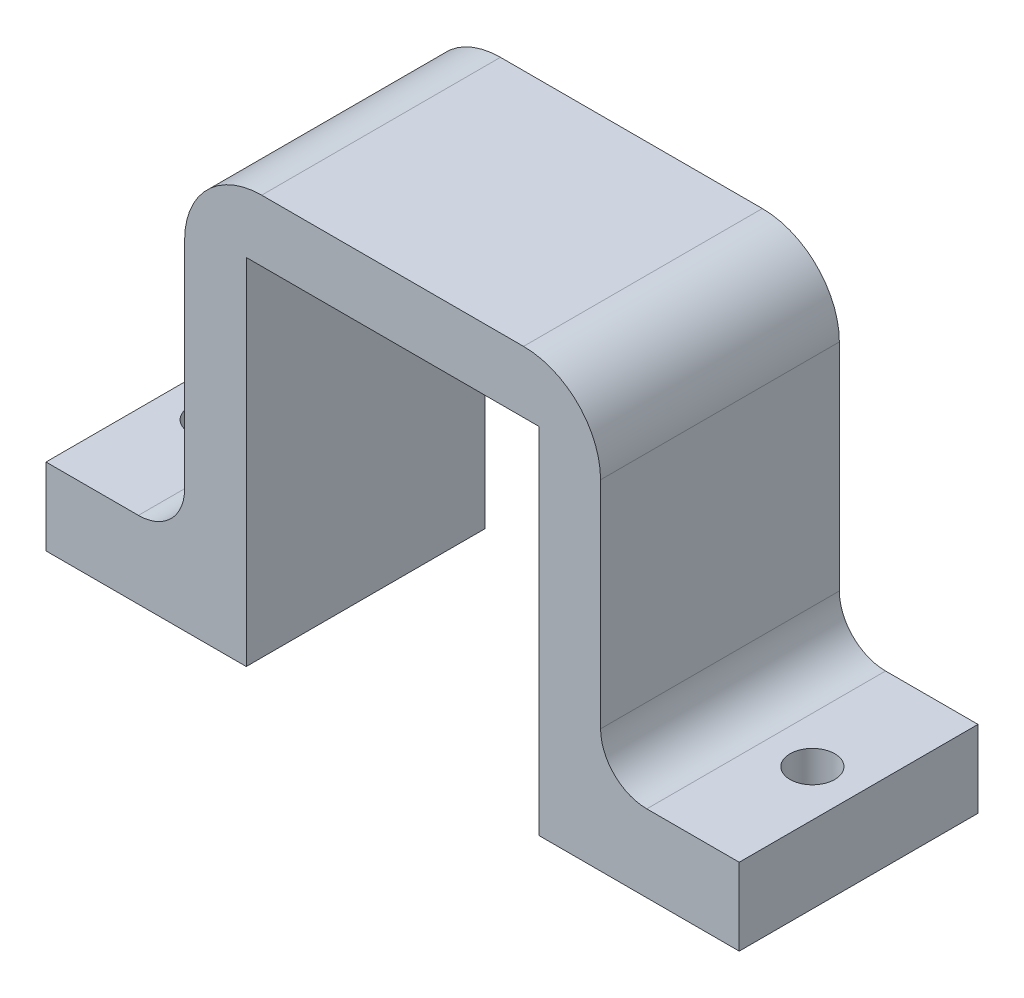
ISO-10303-21;
HEADER;
FILE_DESCRIPTION(('STEP AP214'),'2;1');
FILE_NAME('part.step','',(''),(''),'','','');
FILE_SCHEMA(('AUTOMOTIVE_DESIGN { 1 0 10303 214 1 1 1 1 }'));
ENDSEC;
DATA;
#1=APPLICATION_CONTEXT('core data for automotive mechanical design processes');
#2=APPLICATION_PROTOCOL_DEFINITION('international standard','automotive_design',2000,#1);
#3=PRODUCT_CONTEXT('',#1,'mechanical');
#4=PRODUCT('Part','Part','',(#3));
#5=PRODUCT_RELATED_PRODUCT_CATEGORY('part','',(#4));
#6=PRODUCT_DEFINITION_FORMATION('','',#4);
#7=PRODUCT_DEFINITION_CONTEXT('part definition',#1,'design');
#8=PRODUCT_DEFINITION('design','',#6,#7);
#9=PRODUCT_DEFINITION_SHAPE('','',#8);
#10=(LENGTH_UNIT() NAMED_UNIT(*) SI_UNIT(.MILLI.,.METRE.));
#11=(NAMED_UNIT(*) PLANE_ANGLE_UNIT() SI_UNIT($,.RADIAN.));
#12=(NAMED_UNIT(*) SI_UNIT($,.STERADIAN.) SOLID_ANGLE_UNIT());
#13=UNCERTAINTY_MEASURE_WITH_UNIT(LENGTH_MEASURE(1.E-05),#10,'distance_accuracy_value','');
#14=(GEOMETRIC_REPRESENTATION_CONTEXT(3) GLOBAL_UNCERTAINTY_ASSIGNED_CONTEXT((#13)) GLOBAL_UNIT_ASSIGNED_CONTEXT((#10,
#11,#12)) REPRESENTATION_CONTEXT('',''));
#15=CARTESIAN_POINT('',(0.,0.,0.));
#16=DIRECTION('',(0.,0.,1.));
#17=DIRECTION('',(1.,0.,0.));
#18=AXIS2_PLACEMENT_3D('',#15,#16,#17);
#19=CARTESIAN_POINT('',(0.,3.00000000000002,23.));
#20=DIRECTION('',(1.,0.,0.));
#21=DIRECTION('',(0.,0.,-1.));
#22=AXIS2_PLACEMENT_3D('',#19,#20,#21);
#23=PLANE('',#22);
#24=DIRECTION('',(0.,1.,0.));
#25=VECTOR('',#24,1.);
#26=CARTESIAN_POINT('',(0.,3.00000000000002,7.5));
#27=LINE('',#26,#25);
#28=CARTESIAN_POINT('',(0.,3.00000000000002,7.5));
#29=VERTEX_POINT('',#28);
#30=CARTESIAN_POINT('',(0.,17.,7.5));
#31=VERTEX_POINT('',#30);
#32=EDGE_CURVE('E254',#29,#31,#27,.T.);
#33=ORIENTED_EDGE('',*,*,#32,.F.);
#34=DIRECTION('',(0.,0.,-1.));
#35=VECTOR('',#34,1.);
#36=CARTESIAN_POINT('',(0.,3.00000000000002,23.));
#37=LINE('',#36,#35);
#38=CARTESIAN_POINT('',(0.,3.00000000000002,23.));
#39=VERTEX_POINT('',#38);
#40=EDGE_CURVE('E312',#39,#29,#37,.T.);
#41=ORIENTED_EDGE('',*,*,#40,.F.);
#42=DIRECTION('',(0.,-1.,0.));
#43=VECTOR('',#42,1.);
#44=CARTESIAN_POINT('',(0.,3.00000000000002,23.));
#45=LINE('',#44,#43);
#46=CARTESIAN_POINT('',(0.,17.,23.));
#47=VERTEX_POINT('',#46);
#48=EDGE_CURVE('E279',#47,#39,#45,.T.);
#49=ORIENTED_EDGE('',*,*,#48,.F.);
#50=DIRECTION('',(0.,0.,-1.));
#51=VECTOR('',#50,1.);
#52=CARTESIAN_POINT('',(0.,17.,23.));
#53=LINE('',#52,#51);
#54=EDGE_CURVE('E316',#47,#31,#53,.T.);
#55=ORIENTED_EDGE('',*,*,#54,.T.);
#56=EDGE_LOOP('',(#33,#41,#49,#55));
#57=FACE_BOUND('',#56,.T.);
#58=ADVANCED_FACE('F45',(#57),#23,.F.);
#59=CARTESIAN_POINT('',(-3.,3.,23.));
#60=DIRECTION('',(0.,0.,-1.));
#61=DIRECTION('',(-1.,0.,0.));
#62=AXIS2_PLACEMENT_3D('',#59,#60,#61);
#63=CYLINDRICAL_SURFACE('',#62,3.);
#64=CARTESIAN_POINT('',(-3.,3.,7.5));
#65=DIRECTION('',(0.,0.,-1.));
#66=DIRECTION('',(0.,1.,0.));
#67=AXIS2_PLACEMENT_3D('',#64,#65,#66);
#68=CIRCLE('',#67,3.);
#69=CARTESIAN_POINT('',(-3.00000000000002,0.,7.5));
#70=VERTEX_POINT('',#69);
#71=EDGE_CURVE('E251',#70,#29,#68,.F.);
#72=ORIENTED_EDGE('',*,*,#71,.F.);
#73=DIRECTION('',(0.,0.,-1.));
#74=VECTOR('',#73,1.);
#75=CARTESIAN_POINT('',(-3.00000000000002,0.,23.));
#76=LINE('',#75,#74);
#77=CARTESIAN_POINT('',(-3.00000000000002,0.,23.));
#78=VERTEX_POINT('',#77);
#79=EDGE_CURVE('E308',#78,#70,#76,.T.);
#80=ORIENTED_EDGE('',*,*,#79,.F.);
#81=CARTESIAN_POINT('',(-3.,3.,23.));
#82=DIRECTION('',(0.,0.,-1.));
#83=DIRECTION('',(-1.,0.,0.));
#84=AXIS2_PLACEMENT_3D('',#81,#82,#83);
#85=CIRCLE('',#84,3.);
#86=EDGE_CURVE('E282',#39,#78,#85,.T.);
#87=ORIENTED_EDGE('',*,*,#86,.F.);
#88=ORIENTED_EDGE('',*,*,#40,.T.);
#89=EDGE_LOOP('',(#72,#80,#87,#88));
#90=FACE_BOUND('',#89,.T.);
#91=ADVANCED_FACE('F367',(#90),#63,.F.);
#92=CARTESIAN_POINT('',(-9.,0.,23.));
#93=DIRECTION('',(0.,-1.,0.));
#94=DIRECTION('',(0.,0.,-1.));
#95=AXIS2_PLACEMENT_3D('',#92,#93,#94);
#96=PLANE('',#95);
#97=CARTESIAN_POINT('',(-6.00000000000001,0.,15.25));
#98=DIRECTION('',(0.,1.,0.));
#99=DIRECTION('',(0.,0.,1.));
#100=AXIS2_PLACEMENT_3D('',#97,#98,#99);
#101=CIRCLE('',#100,1.45);
#102=CARTESIAN_POINT('',(-6.00000000000001,0.,16.7));
#103=VERTEX_POINT('',#102);
#104=EDGE_CURVE('E213',#103,#103,#101,.T.);
#105=ORIENTED_EDGE('',*,*,#104,.F.);
#106=EDGE_LOOP('',(#105));
#107=FACE_BOUND('',#106,.T.);
#108=DIRECTION('',(1.,0.,0.));
#109=VECTOR('',#108,1.);
#110=CARTESIAN_POINT('',(-9.,0.,7.5));
#111=LINE('',#110,#109);
#112=CARTESIAN_POINT('',(-9.,0.,7.5));
#113=VERTEX_POINT('',#112);
#114=EDGE_CURVE('E248',#113,#70,#111,.T.);
#115=ORIENTED_EDGE('',*,*,#114,.F.);
#116=DIRECTION('',(0.,0.,-1.));
#117=VECTOR('',#116,1.);
#118=CARTESIAN_POINT('',(-9.,0.,23.));
#119=LINE('',#118,#117);
#120=CARTESIAN_POINT('',(-9.,0.,23.));
#121=VERTEX_POINT('',#120);
#122=EDGE_CURVE('E304',#121,#113,#119,.T.);
#123=ORIENTED_EDGE('',*,*,#122,.F.);
#124=DIRECTION('',(-1.,0.,0.));
#125=VECTOR('',#124,1.);
#126=CARTESIAN_POINT('',(-9.,0.,23.));
#127=LINE('',#126,#125);
#128=EDGE_CURVE('E285',#78,#121,#127,.T.);
#129=ORIENTED_EDGE('',*,*,#128,.F.);
#130=ORIENTED_EDGE('',*,*,#79,.T.);
#131=EDGE_LOOP('',(#115,#123,#129,#130));
#132=FACE_BOUND('',#131,.T.);
#133=ADVANCED_FACE('F374',(#107,#132),#96,.F.);
#134=CARTESIAN_POINT('',(-9.,-4.,23.));
#135=DIRECTION('',(1.,0.,0.));
#136=DIRECTION('',(0.,1.,0.));
#137=AXIS2_PLACEMENT_3D('',#134,#135,#136);
#138=PLANE('',#137);
#139=DIRECTION('',(0.,1.,0.));
#140=VECTOR('',#139,1.);
#141=CARTESIAN_POINT('',(-9.,-4.,7.5));
#142=LINE('',#141,#140);
#143=CARTESIAN_POINT('',(-8.99999999999999,-5.00000000000001,7.5));
#144=VERTEX_POINT('',#143);
#145=EDGE_CURVE('E245',#144,#113,#142,.T.);
#146=ORIENTED_EDGE('',*,*,#145,.F.);
#147=DIRECTION('',(0.,0.,-1.));
#148=VECTOR('',#147,1.);
#149=CARTESIAN_POINT('',(-8.99999999999999,-5.00000000000001,23.));
#150=LINE('',#149,#148);
#151=CARTESIAN_POINT('',(-8.99999999999999,-5.00000000000001,23.));
#152=VERTEX_POINT('',#151);
#153=EDGE_CURVE('E206',#152,#144,#150,.T.);
#154=ORIENTED_EDGE('',*,*,#153,.F.);
#155=DIRECTION('',(0.,-1.,0.));
#156=VECTOR('',#155,1.);
#157=CARTESIAN_POINT('',(-9.,-4.,23.));
#158=LINE('',#157,#156);
#159=EDGE_CURVE('E288',#121,#152,#158,.T.);
#160=ORIENTED_EDGE('',*,*,#159,.F.);
#161=ORIENTED_EDGE('',*,*,#122,.T.);
#162=EDGE_LOOP('',(#146,#154,#160,#161));
#163=FACE_BOUND('',#162,.T.);
#164=ADVANCED_FACE('F439',(#163),#138,.F.);
#165=CARTESIAN_POINT('',(4.,18.,23.));
#166=DIRECTION('',(-1.,0.,0.));
#167=DIRECTION('',(0.,-1.,0.));
#168=AXIS2_PLACEMENT_3D('',#165,#166,#167);
#169=PLANE('',#168);
#170=DIRECTION('',(0.,-1.,0.));
#171=VECTOR('',#170,1.);
#172=CARTESIAN_POINT('',(4.,18.,7.5));
#173=LINE('',#172,#171);
#174=CARTESIAN_POINT('',(4.,18.,7.5));
#175=VERTEX_POINT('',#174);
#176=CARTESIAN_POINT('',(4.,-5.00000000000001,7.5));
#177=VERTEX_POINT('',#176);
#178=EDGE_CURVE('E11',#175,#177,#173,.T.);
#179=ORIENTED_EDGE('',*,*,#178,.F.);
#180=DIRECTION('',(0.,0.,-1.));
#181=VECTOR('',#180,1.);
#182=CARTESIAN_POINT('',(4.,18.,23.));
#183=LINE('',#182,#181);
#184=CARTESIAN_POINT('',(4.,18.,23.));
#185=VERTEX_POINT('',#184);
#186=EDGE_CURVE('E300',#185,#175,#183,.T.);
#187=ORIENTED_EDGE('',*,*,#186,.F.);
#188=DIRECTION('',(0.,1.,0.));
#189=VECTOR('',#188,1.);
#190=CARTESIAN_POINT('',(4.,18.,23.));
#191=LINE('',#190,#189);
#192=CARTESIAN_POINT('',(4.,-5.00000000000001,23.));
#193=VERTEX_POINT('',#192);
#194=EDGE_CURVE('E68',#193,#185,#191,.T.);
#195=ORIENTED_EDGE('',*,*,#194,.F.);
#196=DIRECTION('',(0.,0.,1.));
#197=VECTOR('',#196,1.);
#198=CARTESIAN_POINT('',(4.,-5.00000000000001,23.));
#199=LINE('',#198,#197);
#200=EDGE_CURVE('E190',#177,#193,#199,.T.);
#201=ORIENTED_EDGE('',*,*,#200,.F.);
#202=EDGE_LOOP('',(#179,#187,#195,#201));
#203=FACE_BOUND('',#202,.T.);
#204=ADVANCED_FACE('F407',(#203),#169,.F.);
#205=CARTESIAN_POINT('',(36.,0.,23.));
#206=DIRECTION('',(-1.,0.,0.));
#207=DIRECTION('',(0.,0.,1.));
#208=AXIS2_PLACEMENT_3D('',#205,#206,#207);
#209=PLANE('',#208);
#210=DIRECTION('',(0.,1.,0.));
#211=VECTOR('',#210,1.);
#212=CARTESIAN_POINT('',(36.,0.,23.));
#213=LINE('',#212,#211);
#214=CARTESIAN_POINT('',(36.,-5.,23.));
#215=VERTEX_POINT('',#214);
#216=CARTESIAN_POINT('',(36.,0.,23.));
#217=VERTEX_POINT('',#216);
#218=EDGE_CURVE('E257',#215,#217,#213,.T.);
#219=ORIENTED_EDGE('',*,*,#218,.F.);
#220=DIRECTION('',(0.,0.,1.));
#221=VECTOR('',#220,1.);
#222=CARTESIAN_POINT('',(36.,-5.,23.));
#223=LINE('',#222,#221);
#224=CARTESIAN_POINT('',(36.,-5.,7.5));
#225=VERTEX_POINT('',#224);
#226=EDGE_CURVE('E183',#225,#215,#223,.T.);
#227=ORIENTED_EDGE('',*,*,#226,.F.);
#228=DIRECTION('',(0.,1.,0.));
#229=VECTOR('',#228,1.);
#230=CARTESIAN_POINT('',(36.,-4.00000000000001,7.5));
#231=LINE('',#230,#229);
#232=CARTESIAN_POINT('',(36.,0.,7.5));
#233=VERTEX_POINT('',#232);
#234=EDGE_CURVE('E178',#225,#233,#231,.T.);
#235=ORIENTED_EDGE('',*,*,#234,.T.);
#236=DIRECTION('',(0.,0.,-1.));
#237=VECTOR('',#236,1.);
#238=CARTESIAN_POINT('',(36.,0.,23.));
#239=LINE('',#238,#237);
#240=EDGE_CURVE('E55',#217,#233,#239,.T.);
#241=ORIENTED_EDGE('',*,*,#240,.F.);
#242=EDGE_LOOP('',(#219,#227,#235,#241));
#243=FACE_BOUND('',#242,.T.);
#244=ADVANCED_FACE('F47',(#243),#209,.F.);
#245=CARTESIAN_POINT('',(30.,0.,23.));
#246=DIRECTION('',(0.,-1.,0.));
#247=DIRECTION('',(0.,0.,-1.));
#248=AXIS2_PLACEMENT_3D('',#245,#246,#247);
#249=PLANE('',#248);
#250=CARTESIAN_POINT('',(33.,0.,15.25));
#251=DIRECTION('',(0.,1.,0.));
#252=DIRECTION('',(0.,0.,-1.));
#253=AXIS2_PLACEMENT_3D('',#250,#251,#252);
#254=CIRCLE('',#253,1.45);
#255=CARTESIAN_POINT('',(33.,0.,13.8));
#256=VERTEX_POINT('',#255);
#257=EDGE_CURVE('E201',#256,#256,#254,.T.);
#258=ORIENTED_EDGE('',*,*,#257,.F.);
#259=EDGE_LOOP('',(#258));
#260=FACE_BOUND('',#259,.T.);
#261=ORIENTED_EDGE('',*,*,#240,.T.);
#262=DIRECTION('',(-1.,0.,0.));
#263=VECTOR('',#262,1.);
#264=CARTESIAN_POINT('',(30.,0.,7.5));
#265=LINE('',#264,#263);
#266=CARTESIAN_POINT('',(30.,0.,7.5));
#267=VERTEX_POINT('',#266);
#268=EDGE_CURVE('E241',#233,#267,#265,.T.);
#269=ORIENTED_EDGE('',*,*,#268,.T.);
#270=DIRECTION('',(0.,0.,-1.));
#271=VECTOR('',#270,1.);
#272=CARTESIAN_POINT('',(30.,0.,23.));
#273=LINE('',#272,#271);
#274=CARTESIAN_POINT('',(30.,0.,23.));
#275=VERTEX_POINT('',#274);
#276=EDGE_CURVE('E336',#275,#267,#273,.T.);
#277=ORIENTED_EDGE('',*,*,#276,.F.);
#278=DIRECTION('',(-1.,0.,0.));
#279=VECTOR('',#278,1.);
#280=CARTESIAN_POINT('',(30.,0.,23.));
#281=LINE('',#280,#279);
#282=EDGE_CURVE('E261',#217,#275,#281,.T.);
#283=ORIENTED_EDGE('',*,*,#282,.F.);
#284=EDGE_LOOP('',(#261,#269,#277,#283));
#285=FACE_BOUND('',#284,.T.);
#286=ADVANCED_FACE('F398',(#260,#285),#249,.F.);
#287=CARTESIAN_POINT('',(30.,3.,23.));
#288=DIRECTION('',(0.,0.,-1.));
#289=DIRECTION('',(-1.,0.,0.));
#290=AXIS2_PLACEMENT_3D('',#287,#288,#289);
#291=CYLINDRICAL_SURFACE('',#290,3.);
#292=ORIENTED_EDGE('',*,*,#276,.T.);
#293=CARTESIAN_POINT('',(30.,3.,7.5));
#294=DIRECTION('',(0.,0.,1.));
#295=DIRECTION('',(1.,0.,0.));
#296=AXIS2_PLACEMENT_3D('',#293,#294,#295);
#297=CIRCLE('',#296,3.);
#298=CARTESIAN_POINT('',(27.,3.,7.5));
#299=VERTEX_POINT('',#298);
#300=EDGE_CURVE('E237',#267,#299,#297,.F.);
#301=ORIENTED_EDGE('',*,*,#300,.T.);
#302=DIRECTION('',(0.,0.,-1.));
#303=VECTOR('',#302,1.);
#304=CARTESIAN_POINT('',(27.,3.,23.));
#305=LINE('',#304,#303);
#306=CARTESIAN_POINT('',(27.,3.,23.));
#307=VERTEX_POINT('',#306);
#308=EDGE_CURVE('E332',#307,#299,#305,.T.);
#309=ORIENTED_EDGE('',*,*,#308,.F.);
#310=CARTESIAN_POINT('',(30.,3.,23.));
#311=DIRECTION('',(0.,0.,-1.));
#312=DIRECTION('',(-1.,0.,0.));
#313=AXIS2_PLACEMENT_3D('',#310,#311,#312);
#314=CIRCLE('',#313,3.);
#315=EDGE_CURVE('E264',#275,#307,#314,.T.);
#316=ORIENTED_EDGE('',*,*,#315,.F.);
#317=EDGE_LOOP('',(#292,#301,#309,#316));
#318=FACE_BOUND('',#317,.T.);
#319=ADVANCED_FACE('F396',(#318),#291,.F.);
#320=CARTESIAN_POINT('',(27.,17.,23.));
#321=DIRECTION('',(-1.,0.,0.));
#322=DIRECTION('',(0.,-1.,0.));
#323=AXIS2_PLACEMENT_3D('',#320,#321,#322);
#324=PLANE('',#323);
#325=ORIENTED_EDGE('',*,*,#308,.T.);
#326=DIRECTION('',(0.,1.,0.));
#327=VECTOR('',#326,1.);
#328=CARTESIAN_POINT('',(27.,17.,7.5));
#329=LINE('',#328,#327);
#330=CARTESIAN_POINT('',(27.,17.,7.5));
#331=VERTEX_POINT('',#330);
#332=EDGE_CURVE('E233',#299,#331,#329,.T.);
#333=ORIENTED_EDGE('',*,*,#332,.T.);
#334=DIRECTION('',(0.,0.,-1.));
#335=VECTOR('',#334,1.);
#336=CARTESIAN_POINT('',(27.,17.,23.));
#337=LINE('',#336,#335);
#338=CARTESIAN_POINT('',(27.,17.,23.));
#339=VERTEX_POINT('',#338);
#340=EDGE_CURVE('E328',#339,#331,#337,.T.);
#341=ORIENTED_EDGE('',*,*,#340,.F.);
#342=DIRECTION('',(0.,1.,0.));
#343=VECTOR('',#342,1.);
#344=CARTESIAN_POINT('',(27.,17.,23.));
#345=LINE('',#344,#343);
#346=EDGE_CURVE('E267',#307,#339,#345,.T.);
#347=ORIENTED_EDGE('',*,*,#346,.F.);
#348=EDGE_LOOP('',(#325,#333,#341,#347));
#349=FACE_BOUND('',#348,.T.);
#350=ADVANCED_FACE('F392',(#349),#324,.F.);
#351=CARTESIAN_POINT('',(22.,17.,23.));
#352=DIRECTION('',(0.,0.,-1.));
#353=DIRECTION('',(-1.,0.,0.));
#354=AXIS2_PLACEMENT_3D('',#351,#352,#353);
#355=CYLINDRICAL_SURFACE('',#354,5.);
#356=ORIENTED_EDGE('',*,*,#340,.T.);
#357=CARTESIAN_POINT('',(22.,17.,7.5));
#358=DIRECTION('',(0.,0.,1.));
#359=DIRECTION('',(1.,0.,0.));
#360=AXIS2_PLACEMENT_3D('',#357,#358,#359);
#361=CIRCLE('',#360,5.);
#362=CARTESIAN_POINT('',(22.,22.,7.5));
#363=VERTEX_POINT('',#362);
#364=EDGE_CURVE('E170',#331,#363,#361,.T.);
#365=ORIENTED_EDGE('',*,*,#364,.T.);
#366=DIRECTION('',(0.,0.,-1.));
#367=VECTOR('',#366,1.);
#368=CARTESIAN_POINT('',(22.,22.,23.));
#369=LINE('',#368,#367);
#370=CARTESIAN_POINT('',(22.,22.,23.));
#371=VERTEX_POINT('',#370);
#372=EDGE_CURVE('E324',#371,#363,#369,.T.);
#373=ORIENTED_EDGE('',*,*,#372,.F.);
#374=CARTESIAN_POINT('',(22.,17.,23.));
#375=DIRECTION('',(0.,0.,1.));
#376=DIRECTION('',(-1.,0.,0.));
#377=AXIS2_PLACEMENT_3D('',#374,#375,#376);
#378=CIRCLE('',#377,5.);
#379=EDGE_CURVE('E270',#339,#371,#378,.T.);
#380=ORIENTED_EDGE('',*,*,#379,.F.);
#381=EDGE_LOOP('',(#356,#365,#373,#380));
#382=FACE_BOUND('',#381,.T.);
#383=ADVANCED_FACE('F388',(#382),#355,.T.);
#384=CARTESIAN_POINT('',(5.00000000000004,22.,23.));
#385=DIRECTION('',(0.,-1.,0.));
#386=DIRECTION('',(0.,0.,-1.));
#387=AXIS2_PLACEMENT_3D('',#384,#385,#386);
#388=PLANE('',#387);
#389=ORIENTED_EDGE('',*,*,#372,.T.);
#390=DIRECTION('',(1.,0.,0.));
#391=VECTOR('',#390,1.);
#392=CARTESIAN_POINT('',(-9.,22.,7.5));
#393=LINE('',#392,#391);
#394=CARTESIAN_POINT('',(5.,22.,7.5));
#395=VERTEX_POINT('',#394);
#396=EDGE_CURVE('E217',#395,#363,#393,.T.);
#397=ORIENTED_EDGE('',*,*,#396,.F.);
#398=DIRECTION('',(0.,0.,-1.));
#399=VECTOR('',#398,1.);
#400=CARTESIAN_POINT('',(5.00000000000004,22.,23.));
#401=LINE('',#400,#399);
#402=CARTESIAN_POINT('',(5.00000000000004,22.,23.));
#403=VERTEX_POINT('',#402);
#404=EDGE_CURVE('E320',#403,#395,#401,.T.);
#405=ORIENTED_EDGE('',*,*,#404,.F.);
#406=DIRECTION('',(-1.,0.,0.));
#407=VECTOR('',#406,1.);
#408=CARTESIAN_POINT('',(5.00000000000004,22.,23.));
#409=LINE('',#408,#407);
#410=EDGE_CURVE('E273',#371,#403,#409,.T.);
#411=ORIENTED_EDGE('',*,*,#410,.F.);
#412=EDGE_LOOP('',(#389,#397,#405,#411));
#413=FACE_BOUND('',#412,.T.);
#414=ADVANCED_FACE('F384',(#413),#388,.F.);
#415=CARTESIAN_POINT('',(5.,17.,23.));
#416=DIRECTION('',(0.,0.,-1.));
#417=DIRECTION('',(-1.,0.,0.));
#418=AXIS2_PLACEMENT_3D('',#415,#416,#417);
#419=CYLINDRICAL_SURFACE('',#418,5.);
#420=ORIENTED_EDGE('',*,*,#404,.T.);
#421=CARTESIAN_POINT('',(5.,17.,7.5));
#422=DIRECTION('',(0.,0.,1.));
#423=DIRECTION('',(1.,0.,0.));
#424=AXIS2_PLACEMENT_3D('',#421,#422,#423);
#425=CIRCLE('',#424,5.);
#426=EDGE_CURVE('E225',#395,#31,#425,.T.);
#427=ORIENTED_EDGE('',*,*,#426,.T.);
#428=ORIENTED_EDGE('',*,*,#54,.F.);
#429=CARTESIAN_POINT('',(5.,17.,23.));
#430=DIRECTION('',(0.,0.,1.));
#431=DIRECTION('',(1.,0.,0.));
#432=AXIS2_PLACEMENT_3D('',#429,#430,#431);
#433=CIRCLE('',#432,5.);
#434=EDGE_CURVE('E276',#403,#47,#433,.T.);
#435=ORIENTED_EDGE('',*,*,#434,.F.);
#436=EDGE_LOOP('',(#420,#427,#428,#435));
#437=FACE_BOUND('',#436,.T.);
#438=ADVANCED_FACE('F380',(#437),#419,.T.);
#439=CARTESIAN_POINT('',(23.,18.,23.));
#440=DIRECTION('',(0.,1.,0.));
#441=DIRECTION('',(-1.,0.,0.));
#442=AXIS2_PLACEMENT_3D('',#439,#440,#441);
#443=PLANE('',#442);
#444=ORIENTED_EDGE('',*,*,#186,.T.);
#445=DIRECTION('',(1.,0.,0.));
#446=VECTOR('',#445,1.);
#447=CARTESIAN_POINT('',(23.,18.,7.5));
#448=LINE('',#447,#446);
#449=CARTESIAN_POINT('',(23.,18.,7.5));
#450=VERTEX_POINT('',#449);
#451=EDGE_CURVE('E171',#175,#450,#448,.T.);
#452=ORIENTED_EDGE('',*,*,#451,.T.);
#453=DIRECTION('',(0.,0.,-1.));
#454=VECTOR('',#453,1.);
#455=CARTESIAN_POINT('',(23.,18.,23.));
#456=LINE('',#455,#454);
#457=CARTESIAN_POINT('',(23.,18.,23.));
#458=VERTEX_POINT('',#457);
#459=EDGE_CURVE('E165',#458,#450,#456,.T.);
#460=ORIENTED_EDGE('',*,*,#459,.F.);
#461=DIRECTION('',(1.,0.,0.));
#462=VECTOR('',#461,1.);
#463=CARTESIAN_POINT('',(23.,18.,23.));
#464=LINE('',#463,#462);
#465=EDGE_CURVE('E63',#185,#458,#464,.T.);
#466=ORIENTED_EDGE('',*,*,#465,.F.);
#467=EDGE_LOOP('',(#444,#452,#460,#466));
#468=FACE_BOUND('',#467,.T.);
#469=ADVANCED_FACE('F383',(#468),#443,.F.);
#470=CARTESIAN_POINT('',(23.,-4.,23.));
#471=DIRECTION('',(1.,0.,0.));
#472=DIRECTION('',(0.,0.,-1.));
#473=AXIS2_PLACEMENT_3D('',#470,#471,#472);
#474=PLANE('',#473);
#475=ORIENTED_EDGE('',*,*,#459,.T.);
#476=DIRECTION('',(0.,-1.,0.));
#477=VECTOR('',#476,1.);
#478=CARTESIAN_POINT('',(23.,-4.,7.5));
#479=LINE('',#478,#477);
#480=CARTESIAN_POINT('',(23.,-5.,7.5));
#481=VERTEX_POINT('',#480);
#482=EDGE_CURVE('E159',#450,#481,#479,.T.);
#483=ORIENTED_EDGE('',*,*,#482,.T.);
#484=DIRECTION('',(0.,0.,-1.));
#485=VECTOR('',#484,1.);
#486=CARTESIAN_POINT('',(23.,-5.,23.));
#487=LINE('',#486,#485);
#488=CARTESIAN_POINT('',(23.,-5.,23.));
#489=VERTEX_POINT('',#488);
#490=EDGE_CURVE('E164',#489,#481,#487,.T.);
#491=ORIENTED_EDGE('',*,*,#490,.F.);
#492=DIRECTION('',(0.,-1.,0.));
#493=VECTOR('',#492,1.);
#494=CARTESIAN_POINT('',(23.,-4.,23.));
#495=LINE('',#494,#493);
#496=EDGE_CURVE('E295',#458,#489,#495,.T.);
#497=ORIENTED_EDGE('',*,*,#496,.F.);
#498=EDGE_LOOP('',(#475,#483,#491,#497));
#499=FACE_BOUND('',#498,.T.);
#500=ADVANCED_FACE('F161',(#499),#474,.F.);
#501=CARTESIAN_POINT('',(-3.,3.,23.));
#502=DIRECTION('',(0.,0.,-1.));
#503=DIRECTION('',(-1.,0.,0.));
#504=AXIS2_PLACEMENT_3D('',#501,#502,#503);
#505=PLANE('',#504);
#506=ORIENTED_EDGE('',*,*,#218,.T.);
#507=ORIENTED_EDGE('',*,*,#282,.T.);
#508=ORIENTED_EDGE('',*,*,#315,.T.);
#509=ORIENTED_EDGE('',*,*,#346,.T.);
#510=ORIENTED_EDGE('',*,*,#379,.T.);
#511=ORIENTED_EDGE('',*,*,#410,.T.);
#512=ORIENTED_EDGE('',*,*,#434,.T.);
#513=ORIENTED_EDGE('',*,*,#48,.T.);
#514=ORIENTED_EDGE('',*,*,#86,.T.);
#515=ORIENTED_EDGE('',*,*,#128,.T.);
#516=ORIENTED_EDGE('',*,*,#159,.T.);
#517=DIRECTION('',(-1.,0.,0.));
#518=VECTOR('',#517,1.);
#519=CARTESIAN_POINT('',(4.,-5.00000000000001,23.));
#520=LINE('',#519,#518);
#521=EDGE_CURVE('E194',#193,#152,#520,.T.);
#522=ORIENTED_EDGE('',*,*,#521,.F.);
#523=ORIENTED_EDGE('',*,*,#194,.T.);
#524=ORIENTED_EDGE('',*,*,#465,.T.);
#525=ORIENTED_EDGE('',*,*,#496,.T.);
#526=DIRECTION('',(-1.,0.,0.));
#527=VECTOR('',#526,1.);
#528=CARTESIAN_POINT('',(23.,-5.,23.));
#529=LINE('',#528,#527);
#530=EDGE_CURVE('E188',#215,#489,#529,.T.);
#531=ORIENTED_EDGE('',*,*,#530,.F.);
#532=EDGE_LOOP('',(#506,#507,#508,#509,#510,#511,#512,#513,#514,#515,#516,#522,#523,#524,#525,#531));
#533=FACE_BOUND('',#532,.T.);
#534=ADVANCED_FACE('F413',(#533),#505,.F.);
#535=CARTESIAN_POINT('',(-23.,17.,7.5));
#536=DIRECTION('',(0.,0.,-1.));
#537=DIRECTION('',(0.,1.,0.));
#538=AXIS2_PLACEMENT_3D('',#535,#536,#537);
#539=PLANE('',#538);
#540=ORIENTED_EDGE('',*,*,#32,.T.);
#541=ORIENTED_EDGE('',*,*,#426,.F.);
#542=ORIENTED_EDGE('',*,*,#396,.T.);
#543=ORIENTED_EDGE('',*,*,#364,.F.);
#544=ORIENTED_EDGE('',*,*,#332,.F.);
#545=ORIENTED_EDGE('',*,*,#300,.F.);
#546=ORIENTED_EDGE('',*,*,#268,.F.);
#547=ORIENTED_EDGE('',*,*,#234,.F.);
#548=DIRECTION('',(1.,0.,0.));
#549=VECTOR('',#548,1.);
#550=CARTESIAN_POINT('',(23.,-5.,7.5));
#551=LINE('',#550,#549);
#552=EDGE_CURVE('E174',#481,#225,#551,.T.);
#553=ORIENTED_EDGE('',*,*,#552,.F.);
#554=ORIENTED_EDGE('',*,*,#482,.F.);
#555=ORIENTED_EDGE('',*,*,#451,.F.);
#556=ORIENTED_EDGE('',*,*,#178,.T.);
#557=DIRECTION('',(1.,0.,0.));
#558=VECTOR('',#557,1.);
#559=CARTESIAN_POINT('',(4.,-5.00000000000001,7.5));
#560=LINE('',#559,#558);
#561=EDGE_CURVE('E202',#144,#177,#560,.T.);
#562=ORIENTED_EDGE('',*,*,#561,.F.);
#563=ORIENTED_EDGE('',*,*,#145,.T.);
#564=ORIENTED_EDGE('',*,*,#114,.T.);
#565=ORIENTED_EDGE('',*,*,#71,.T.);
#566=EDGE_LOOP('',(#540,#541,#542,#543,#544,#545,#546,#547,#553,#554,#555,#556,#562,#563,#564,#565));
#567=FACE_BOUND('',#566,.T.);
#568=ADVANCED_FACE('F176',(#567),#539,.T.);
#569=CARTESIAN_POINT('',(33.,-50.,15.25));
#570=DIRECTION('',(0.,1.,0.));
#571=DIRECTION('',(0.,0.,1.));
#572=AXIS2_PLACEMENT_3D('',#569,#570,#571);
#573=CYLINDRICAL_SURFACE('',#572,1.45);
#574=ORIENTED_EDGE('',*,*,#257,.T.);
#575=EDGE_LOOP('',(#574));
#576=FACE_BOUND('',#575,.T.);
#577=CARTESIAN_POINT('',(33.,-5.,15.25));
#578=DIRECTION('',(0.,-1.,0.));
#579=DIRECTION('',(1.,0.,0.));
#580=AXIS2_PLACEMENT_3D('',#577,#578,#579);
#581=CIRCLE('',#580,1.45);
#582=CARTESIAN_POINT('',(34.45,-5.,15.25));
#583=VERTEX_POINT('',#582);
#584=EDGE_CURVE('E342',#583,#583,#581,.T.);
#585=ORIENTED_EDGE('',*,*,#584,.T.);
#586=EDGE_LOOP('',(#585));
#587=FACE_BOUND('',#586,.T.);
#588=ADVANCED_FACE('F356',(#576,#587),#573,.F.);
#589=CARTESIAN_POINT('',(-6.00000000000001,-50.,15.25));
#590=DIRECTION('',(0.,1.,0.));
#591=DIRECTION('',(0.,0.,1.));
#592=AXIS2_PLACEMENT_3D('',#589,#590,#591);
#593=CYLINDRICAL_SURFACE('',#592,1.45);
#594=ORIENTED_EDGE('',*,*,#104,.T.);
#595=EDGE_LOOP('',(#594));
#596=FACE_BOUND('',#595,.T.);
#597=CARTESIAN_POINT('',(-6.,-5.00000000000001,15.25));
#598=DIRECTION('',(0.,1.,0.));
#599=DIRECTION('',(-1.,0.,0.));
#600=AXIS2_PLACEMENT_3D('',#597,#598,#599);
#601=CIRCLE('',#600,1.45);
#602=CARTESIAN_POINT('',(-7.45,-5.00000000000001,15.25));
#603=VERTEX_POINT('',#602);
#604=EDGE_CURVE('E49',#603,#603,#601,.T.);
#605=ORIENTED_EDGE('',*,*,#604,.F.);
#606=EDGE_LOOP('',(#605));
#607=FACE_BOUND('',#606,.T.);
#608=ADVANCED_FACE('F354',(#596,#607),#593,.F.);
#609=CARTESIAN_POINT('',(0.,-5.00000000000001,0.));
#610=DIRECTION('',(0.,1.,0.));
#611=DIRECTION('',(-1.,0.,0.));
#612=AXIS2_PLACEMENT_3D('',#609,#610,#611);
#613=PLANE('',#612);
#614=ORIENTED_EDGE('',*,*,#604,.T.);
#615=EDGE_LOOP('',(#614));
#616=FACE_BOUND('',#615,.T.);
#617=ORIENTED_EDGE('',*,*,#200,.T.);
#618=ORIENTED_EDGE('',*,*,#521,.T.);
#619=ORIENTED_EDGE('',*,*,#153,.T.);
#620=ORIENTED_EDGE('',*,*,#561,.T.);
#621=EDGE_LOOP('',(#617,#618,#619,#620));
#622=FACE_BOUND('',#621,.T.);
#623=ADVANCED_FACE('F351',(#616,#622),#613,.F.);
#624=CARTESIAN_POINT('',(0.,-5.00000000000001,0.));
#625=DIRECTION('',(0.,-1.,0.));
#626=DIRECTION('',(1.,0.,0.));
#627=AXIS2_PLACEMENT_3D('',#624,#625,#626);
#628=PLANE('',#627);
#629=ORIENTED_EDGE('',*,*,#584,.F.);
#630=EDGE_LOOP('',(#629));
#631=FACE_BOUND('',#630,.T.);
#632=ORIENTED_EDGE('',*,*,#490,.T.);
#633=ORIENTED_EDGE('',*,*,#552,.T.);
#634=ORIENTED_EDGE('',*,*,#226,.T.);
#635=ORIENTED_EDGE('',*,*,#530,.T.);
#636=EDGE_LOOP('',(#632,#633,#634,#635));
#637=FACE_BOUND('',#636,.T.);
#638=ADVANCED_FACE('F186',(#631,#637),#628,.T.);
#639=CLOSED_SHELL('',(#58,#91,#133,#164,#204,#244,#286,#319,#350,#383,#414,#438,#469,#500,#534,
#568,#588,#608,#623,#638));
#640=MANIFOLD_SOLID_BREP('B2',#639);
#641=ADVANCED_BREP_SHAPE_REPRESENTATION('',(#18,#640),#14);
#642=SHAPE_DEFINITION_REPRESENTATION(#9,#641);
ENDSEC;
END-ISO-10303-21;
